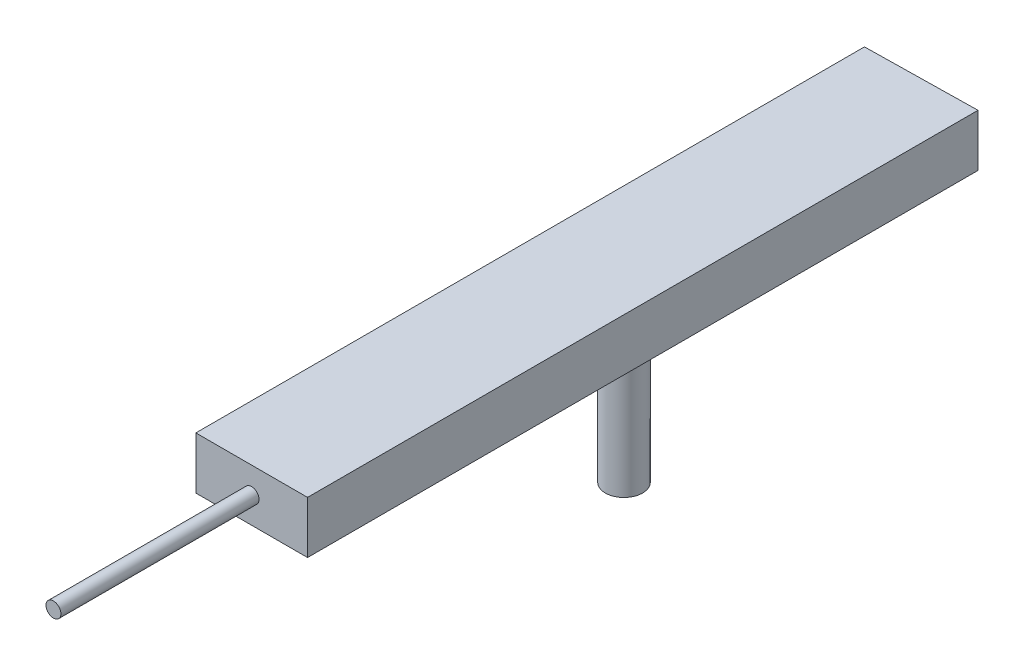
ISO-10303-21;
HEADER;
FILE_DESCRIPTION(('STEP AP214'),'2;1');
FILE_NAME('part.step','',(''),(''),'','','');
FILE_SCHEMA(('AUTOMOTIVE_DESIGN { 1 0 10303 214 1 1 1 1 }'));
ENDSEC;
DATA;
#1=APPLICATION_CONTEXT('core data for automotive mechanical design processes');
#2=APPLICATION_PROTOCOL_DEFINITION('international standard','automotive_design',2000,#1);
#3=PRODUCT_CONTEXT('',#1,'mechanical');
#4=PRODUCT('Part','Part','',(#3));
#5=PRODUCT_RELATED_PRODUCT_CATEGORY('part','',(#4));
#6=PRODUCT_DEFINITION_FORMATION('','',#4);
#7=PRODUCT_DEFINITION_CONTEXT('part definition',#1,'design');
#8=PRODUCT_DEFINITION('design','',#6,#7);
#9=PRODUCT_DEFINITION_SHAPE('','',#8);
#10=(LENGTH_UNIT() NAMED_UNIT(*) SI_UNIT(.MILLI.,.METRE.));
#11=(NAMED_UNIT(*) PLANE_ANGLE_UNIT() SI_UNIT($,.RADIAN.));
#12=(NAMED_UNIT(*) SI_UNIT($,.STERADIAN.) SOLID_ANGLE_UNIT());
#13=UNCERTAINTY_MEASURE_WITH_UNIT(LENGTH_MEASURE(1.E-05),#10,'distance_accuracy_value','');
#14=(GEOMETRIC_REPRESENTATION_CONTEXT(3) GLOBAL_UNCERTAINTY_ASSIGNED_CONTEXT((#13)) GLOBAL_UNIT_ASSIGNED_CONTEXT((#10,
#11,#12)) REPRESENTATION_CONTEXT('',''));
#15=CARTESIAN_POINT('',(0.,0.,0.));
#16=DIRECTION('',(0.,0.,1.));
#17=DIRECTION('',(1.,0.,0.));
#18=AXIS2_PLACEMENT_3D('',#15,#16,#17);
#19=CARTESIAN_POINT('',(3.74193592233407,1.75000005401671,60.0000002980232));
#20=DIRECTION('',(0.,0.,1.));
#21=DIRECTION('',(1.,0.,0.));
#22=AXIS2_PLACEMENT_3D('',#19,#20,#21);
#23=PLANE('',#22);
#24=CARTESIAN_POINT('',(3.74193592233407,1.75000005401671,60.0000002980232));
#25=DIRECTION('',(0.,0.,1.));
#26=DIRECTION('',(1.,0.,0.));
#27=AXIS2_PLACEMENT_3D('',#24,#25,#26);
#28=CIRCLE('',#27,0.5);
#29=CARTESIAN_POINT('',(4.24193592233407,1.75000005401671,60.0000002980232));
#30=VERTEX_POINT('',#29);
#31=EDGE_CURVE('E64',#30,#30,#28,.T.);
#32=ORIENTED_EDGE('',*,*,#31,.F.);
#33=EDGE_LOOP('',(#32));
#34=FACE_BOUND('',#33,.T.);
#35=ADVANCED_FACE('F57',(#34),#23,.F.);
#36=CARTESIAN_POINT('',(3.74193592233407,1.75000005401671,74.7181679039211));
#37=DIRECTION('',(0.,0.,-1.));
#38=DIRECTION('',(-1.,0.,0.));
#39=AXIS2_PLACEMENT_3D('',#36,#37,#38);
#40=CYLINDRICAL_SURFACE('',#39,0.5);
#41=CARTESIAN_POINT('',(3.74193592233407,1.75000005401671,73.303954341548));
#42=DIRECTION('',(0.,0.,-1.));
#43=DIRECTION('',(-1.,0.,0.));
#44=AXIS2_PLACEMENT_3D('',#41,#42,#43);
#45=CIRCLE('',#44,0.5);
#46=CARTESIAN_POINT('',(3.24193592233407,1.75000005401671,73.303954341548));
#47=VERTEX_POINT('',#46);
#48=EDGE_CURVE('E11',#47,#47,#45,.T.);
#49=ORIENTED_EDGE('',*,*,#48,.T.);
#50=EDGE_LOOP('',(#49));
#51=FACE_BOUND('',#50,.T.);
#52=ORIENTED_EDGE('',*,*,#31,.T.);
#53=EDGE_LOOP('',(#52));
#54=FACE_BOUND('',#53,.T.);
#55=ADVANCED_FACE('F59',(#51,#54),#40,.T.);
#56=CARTESIAN_POINT('',(-38.5882533593238,141.044708412088,73.3039543415482));
#57=DIRECTION('',(0.,0.,-1.));
#58=DIRECTION('',(1.,0.,0.));
#59=AXIS2_PLACEMENT_3D('',#56,#57,#58);
#60=PLANE('',#59);
#61=ORIENTED_EDGE('',*,*,#48,.F.);
#62=EDGE_LOOP('',(#61));
#63=FACE_BOUND('',#62,.T.);
#64=ADVANCED_FACE('F75',(#63),#60,.F.);
#65=CLOSED_SHELL('',(#35,#55,#64));
#66=MANIFOLD_SOLID_BREP('B2',#65);
#67=CARTESIAN_POINT('',(7.49999983236194,0.,78.2764728704216));
#68=DIRECTION('',(0.,-1.,0.));
#69=DIRECTION('',(0.,0.,-1.));
#70=AXIS2_PLACEMENT_3D('',#67,#68,#69);
#71=PLANE('',#70);
#72=CARTESIAN_POINT('',(3.75000016356773,0.,35.0000012364363));
#73=DIRECTION('',(0.,-1.,0.));
#74=DIRECTION('',(0.,0.,-1.));
#75=AXIS2_PLACEMENT_3D('',#72,#73,#74);
#76=CIRCLE('',#75,1.2499992750272);
#77=CARTESIAN_POINT('',(3.75000016356773,0.,33.7500019614091));
#78=VERTEX_POINT('',#77);
#79=EDGE_CURVE('E55',#78,#78,#76,.T.);
#80=ORIENTED_EDGE('',*,*,#79,.F.);
#81=EDGE_LOOP('',(#80));
#82=FACE_BOUND('',#81,.T.);
#83=DIRECTION('',(0.,0.,-1.));
#84=VECTOR('',#83,1.);
#85=CARTESIAN_POINT('',(7.49999983236194,0.,78.2764728704216));
#86=LINE('',#85,#84);
#87=CARTESIAN_POINT('',(7.49999983236194,0.,60.0000002980232));
#88=VERTEX_POINT('',#87);
#89=CARTESIAN_POINT('',(7.49999983236194,0.,14.9775894310468));
#90=VERTEX_POINT('',#89);
#91=EDGE_CURVE('E116',#88,#90,#86,.T.);
#92=ORIENTED_EDGE('',*,*,#91,.F.);
#93=DIRECTION('',(1.,0.,0.));
#94=VECTOR('',#93,1.);
#95=CARTESIAN_POINT('',(0.,0.,60.0000002980232));
#96=LINE('',#95,#94);
#97=CARTESIAN_POINT('',(0.,0.,60.0000002980232));
#98=VERTEX_POINT('',#97);
#99=EDGE_CURVE('E123',#98,#88,#96,.T.);
#100=ORIENTED_EDGE('',*,*,#99,.F.);
#101=DIRECTION('',(0.,0.,-1.));
#102=VECTOR('',#101,1.);
#103=CARTESIAN_POINT('',(0.,0.,78.2764728704216));
#104=LINE('',#103,#102);
#105=CARTESIAN_POINT('',(0.,0.,15.1018444358906));
#106=VERTEX_POINT('',#105);
#107=EDGE_CURVE('E159',#98,#106,#104,.T.);
#108=ORIENTED_EDGE('',*,*,#107,.T.);
#109=DIRECTION('',(-0.999862789961335,0.,0.0165650611449047));
#110=VECTOR('',#109,1.);
#111=CARTESIAN_POINT('',(7.36187995923574,0.,14.9798777091652));
#112=LINE('',#111,#110);
#113=EDGE_CURVE('E179',#90,#106,#112,.T.);
#114=ORIENTED_EDGE('',*,*,#113,.F.);
#115=EDGE_LOOP('',(#92,#100,#108,#114));
#116=FACE_BOUND('',#115,.T.);
#117=ADVANCED_FACE('F109',(#82,#116),#71,.T.);
#118=CARTESIAN_POINT('',(0.,3.50000010803342,78.2764728704216));
#119=DIRECTION('',(-1.,0.,0.));
#120=DIRECTION('',(0.,0.,1.));
#121=AXIS2_PLACEMENT_3D('',#118,#119,#120);
#122=PLANE('',#121);
#123=ORIENTED_EDGE('',*,*,#107,.F.);
#124=DIRECTION('',(0.,-1.,0.));
#125=VECTOR('',#124,1.);
#126=CARTESIAN_POINT('',(0.,3.50000010803342,60.0000002980232));
#127=LINE('',#126,#125);
#128=CARTESIAN_POINT('',(0.,3.50000010803342,60.0000002980232));
#129=VERTEX_POINT('',#128);
#130=EDGE_CURVE('E149',#129,#98,#127,.T.);
#131=ORIENTED_EDGE('',*,*,#130,.F.);
#132=DIRECTION('',(0.,0.,-1.));
#133=VECTOR('',#132,1.);
#134=CARTESIAN_POINT('',(0.,3.50000010803342,78.2764728704216));
#135=LINE('',#134,#133);
#136=CARTESIAN_POINT('',(0.,3.50000010803342,15.1018444358906));
#137=VERTEX_POINT('',#136);
#138=EDGE_CURVE('E167',#129,#137,#135,.T.);
#139=ORIENTED_EDGE('',*,*,#138,.T.);
#140=DIRECTION('',(0.,1.,0.));
#141=VECTOR('',#140,1.);
#142=CARTESIAN_POINT('',(0.,0.,15.1018444358906));
#143=LINE('',#142,#141);
#144=EDGE_CURVE('E166',#106,#137,#143,.T.);
#145=ORIENTED_EDGE('',*,*,#144,.F.);
#146=EDGE_LOOP('',(#123,#131,#139,#145));
#147=FACE_BOUND('',#146,.T.);
#148=ADVANCED_FACE('F164',(#147),#122,.T.);
#149=CARTESIAN_POINT('',(7.49999983236194,3.50000010803342,78.2764728704216));
#150=DIRECTION('',(0.,1.,0.));
#151=DIRECTION('',(0.,0.,1.));
#152=AXIS2_PLACEMENT_3D('',#149,#150,#151);
#153=PLANE('',#152);
#154=ORIENTED_EDGE('',*,*,#138,.F.);
#155=DIRECTION('',(-1.,0.,0.));
#156=VECTOR('',#155,1.);
#157=CARTESIAN_POINT('',(0.,3.50000010803342,60.0000002980232));
#158=LINE('',#157,#156);
#159=CARTESIAN_POINT('',(7.49999983236194,3.50000010803342,60.0000002980232));
#160=VERTEX_POINT('',#159);
#161=EDGE_CURVE('E151',#160,#129,#158,.T.);
#162=ORIENTED_EDGE('',*,*,#161,.F.);
#163=DIRECTION('',(0.,0.,-1.));
#164=VECTOR('',#163,1.);
#165=CARTESIAN_POINT('',(7.49999983236194,3.50000010803342,78.2764728704216));
#166=LINE('',#165,#164);
#167=CARTESIAN_POINT('',(7.49999983236194,3.50000010803342,14.9775894310468));
#168=VERTEX_POINT('',#167);
#169=EDGE_CURVE('E131',#160,#168,#166,.T.);
#170=ORIENTED_EDGE('',*,*,#169,.T.);
#171=DIRECTION('',(0.999862789961335,0.,-0.0165650611449047));
#172=VECTOR('',#171,1.);
#173=CARTESIAN_POINT('',(-0.136061863791688,3.50000010803342,15.1040986182803));
#174=LINE('',#173,#172);
#175=EDGE_CURVE('E172',#137,#168,#174,.T.);
#176=ORIENTED_EDGE('',*,*,#175,.F.);
#177=EDGE_LOOP('',(#154,#162,#170,#176));
#178=FACE_BOUND('',#177,.T.);
#179=ADVANCED_FACE('F186',(#178),#153,.T.);
#180=CARTESIAN_POINT('',(7.49999983236194,3.50000010803342,78.2764728704216));
#181=DIRECTION('',(1.,0.,0.));
#182=DIRECTION('',(0.,0.,-1.));
#183=AXIS2_PLACEMENT_3D('',#180,#181,#182);
#184=PLANE('',#183);
#185=ORIENTED_EDGE('',*,*,#169,.F.);
#186=DIRECTION('',(0.,1.,0.));
#187=VECTOR('',#186,1.);
#188=CARTESIAN_POINT('',(7.49999983236194,3.50000010803342,60.0000002980232));
#189=LINE('',#188,#187);
#190=EDGE_CURVE('E161',#88,#160,#189,.T.);
#191=ORIENTED_EDGE('',*,*,#190,.F.);
#192=ORIENTED_EDGE('',*,*,#91,.T.);
#193=DIRECTION('',(0.,-1.,0.));
#194=VECTOR('',#193,1.);
#195=CARTESIAN_POINT('',(7.49999983236194,3.50000010803342,14.9775894310468));
#196=LINE('',#195,#194);
#197=EDGE_CURVE('E181',#168,#90,#196,.T.);
#198=ORIENTED_EDGE('',*,*,#197,.F.);
#199=EDGE_LOOP('',(#185,#191,#192,#198));
#200=FACE_BOUND('',#199,.T.);
#201=ADVANCED_FACE('F187',(#200),#184,.T.);
#202=CARTESIAN_POINT('',(3.75000016356773,3.53553185540002,35.0000012364363));
#203=DIRECTION('',(0.,-1.,0.));
#204=DIRECTION('',(0.,0.,-1.));
#205=AXIS2_PLACEMENT_3D('',#202,#203,#204);
#206=CYLINDRICAL_SURFACE('',#205,1.2499992750272);
#207=CARTESIAN_POINT('',(3.75000016356773,-9.99999977648258,35.0000012364363));
#208=DIRECTION('',(0.,-1.,0.));
#209=DIRECTION('',(0.,0.,-1.));
#210=AXIS2_PLACEMENT_3D('',#207,#208,#209);
#211=CIRCLE('',#210,1.2499992750272);
#212=CARTESIAN_POINT('',(3.75000016356773,-9.99999977648258,33.7500019614091));
#213=VERTEX_POINT('',#212);
#214=EDGE_CURVE('E168',#213,#213,#211,.T.);
#215=CARTESIAN_POINT('',(3.75000016356773,0.,33.7500019614091));
#216=CARTESIAN_POINT('',(3.75000016356773,-0.10416666433836,33.7500019614091));
#217=CARTESIAN_POINT('',(3.75000016356773,-0.20833332867672,33.7500019614091));
#218=CARTESIAN_POINT('',(3.75000016356773,-0.41666665735344,33.7500019614091));
#219=CARTESIAN_POINT('',(3.75000016356773,-0.5208333216918,33.7500019614091));
#220=CARTESIAN_POINT('',(3.75000016356773,-0.729166650368521,33.7500019614091));
#221=CARTESIAN_POINT('',(3.75000016356773,-0.833333314706881,33.7500019614091));
#222=CARTESIAN_POINT('',(3.75000016356773,-1.0416666433836,33.7500019614091));
#223=CARTESIAN_POINT('',(3.75000016356773,-1.14583330772196,33.7500019614091));
#224=CARTESIAN_POINT('',(3.75000016356773,-1.35416663639868,33.7500019614091));
#225=CARTESIAN_POINT('',(3.75000016356773,-1.45833330073704,33.7500019614091));
#226=CARTESIAN_POINT('',(3.75000016356773,-1.66666662941376,33.7500019614091));
#227=CARTESIAN_POINT('',(3.75000016356773,-1.77083329375212,33.7500019614091));
#228=CARTESIAN_POINT('',(3.75000016356773,-1.97916662242884,33.7500019614091));
#229=CARTESIAN_POINT('',(3.75000016356773,-2.0833332867672,33.7500019614091));
#230=CARTESIAN_POINT('',(3.75000016356773,-2.29166661544392,33.7500019614091));
#231=CARTESIAN_POINT('',(3.75000016356773,-2.39583327978228,33.7500019614091));
#232=CARTESIAN_POINT('',(3.75000016356773,-2.604166608459,33.7500019614091));
#233=CARTESIAN_POINT('',(3.75000016356773,-2.70833327279736,33.7500019614091));
#234=CARTESIAN_POINT('',(3.75000016356773,-2.91666660147408,33.7500019614091));
#235=CARTESIAN_POINT('',(3.75000016356773,-3.02083326581245,33.7500019614091));
#236=CARTESIAN_POINT('',(3.75000016356773,-3.22916659448917,33.7500019614091));
#237=CARTESIAN_POINT('',(3.75000016356773,-3.33333325882752,33.7500019614091));
#238=CARTESIAN_POINT('',(3.75000016356773,-3.54166658750425,33.7500019614091));
#239=CARTESIAN_POINT('',(3.75000016356773,-3.64583325184261,33.7500019614091));
#240=CARTESIAN_POINT('',(3.75000016356773,-3.85416658051933,33.7500019614091));
#241=CARTESIAN_POINT('',(3.75000016356773,-3.95833324485769,33.7500019614091));
#242=CARTESIAN_POINT('',(3.75000016356773,-4.16666657353441,33.7500019614091));
#243=CARTESIAN_POINT('',(3.75000016356773,-4.27083323787277,33.7500019614091));
#244=CARTESIAN_POINT('',(3.75000016356773,-4.47916656654949,33.7500019614091));
#245=CARTESIAN_POINT('',(3.75000016356773,-4.58333323088785,33.7500019614091));
#246=CARTESIAN_POINT('',(3.75000016356773,-4.79166655956457,33.7500019614091));
#247=CARTESIAN_POINT('',(3.75000016356773,-4.89583322390293,33.7500019614091));
#248=CARTESIAN_POINT('',(3.75000016356773,-5.10416655257965,33.7500019614091));
#249=CARTESIAN_POINT('',(3.75000016356773,-5.20833321691801,33.7500019614091));
#250=CARTESIAN_POINT('',(3.75000016356773,-5.41666654559473,33.7500019614091));
#251=CARTESIAN_POINT('',(3.75000016356773,-5.52083320993309,33.7500019614091));
#252=CARTESIAN_POINT('',(3.75000016356773,-5.72916653860981,33.7500019614091));
#253=CARTESIAN_POINT('',(3.75000016356773,-5.83333320294817,33.7500019614091));
#254=CARTESIAN_POINT('',(3.75000016356773,-6.04166653162489,33.7500019614091));
#255=CARTESIAN_POINT('',(3.75000016356773,-6.14583319596325,33.7500019614091));
#256=CARTESIAN_POINT('',(3.75000016356773,-6.35416652463997,33.7500019614091));
#257=CARTESIAN_POINT('',(3.75000016356773,-6.45833318897833,33.7500019614091));
#258=CARTESIAN_POINT('',(3.75000016356773,-6.66666651765505,33.7500019614091));
#259=CARTESIAN_POINT('',(3.75000016356773,-6.77083318199341,33.7500019614091));
#260=CARTESIAN_POINT('',(3.75000016356773,-6.97916651067013,33.7500019614091));
#261=CARTESIAN_POINT('',(3.75000016356773,-7.08333317500849,33.7500019614091));
#262=CARTESIAN_POINT('',(3.75000016356773,-7.29166650368521,33.7500019614091));
#263=CARTESIAN_POINT('',(3.75000016356773,-7.39583316802357,33.7500019614091));
#264=CARTESIAN_POINT('',(3.75000016356773,-7.60416649670029,33.7500019614091));
#265=CARTESIAN_POINT('',(3.75000016356773,-7.70833316103865,33.7500019614091));
#266=CARTESIAN_POINT('',(3.75000016356773,-7.91666648971537,33.7500019614091));
#267=CARTESIAN_POINT('',(3.75000016356773,-8.02083315405373,33.7500019614091));
#268=CARTESIAN_POINT('',(3.75000016356773,-8.22916648273045,33.7500019614091));
#269=CARTESIAN_POINT('',(3.75000016356773,-8.33333314706881,33.7500019614091));
#270=CARTESIAN_POINT('',(3.75000016356773,-8.54166647574553,33.7500019614091));
#271=CARTESIAN_POINT('',(3.75000016356773,-8.64583314008389,33.7500019614091));
#272=CARTESIAN_POINT('',(3.75000016356773,-8.85416646876061,33.7500019614091));
#273=CARTESIAN_POINT('',(3.75000016356773,-8.95833313309898,33.7500019614091));
#274=CARTESIAN_POINT('',(3.75000016356773,-9.16666646177569,33.7500019614091));
#275=CARTESIAN_POINT('',(3.75000016356773,-9.27083312611406,33.7500019614091));
#276=CARTESIAN_POINT('',(3.75000016356773,-9.47916645479078,33.7500019614091));
#277=CARTESIAN_POINT('',(3.75000016356773,-9.58333311912914,33.7500019614091));
#278=CARTESIAN_POINT('',(3.75000016356773,-9.79166644780586,33.7500019614091));
#279=CARTESIAN_POINT('',(3.75000016356773,-9.89583311214422,33.7500019614091));
#280=CARTESIAN_POINT('',(3.75000016356773,-9.99999977648258,33.7500019614091));
#281=B_SPLINE_CURVE_WITH_KNOTS('',3,(#215,#216,#217,#218,#219,#220,#221,#222,#223,#224,#225,
#226,#227,#228,#229,#230,#231,#232,#233,#234,#235,#236,#237,#238,#239,#240,#241,#242,#243,#244,
#245,#246,#247,#248,#249,#250,#251,#252,#253,#254,#255,#256,#257,#258,#259,#260,#261,#262,#263,
#264,#265,#266,#267,#268,#269,#270,#271,#272,#273,#274,#275,#276,#277,#278,#279,#280),
.UNSPECIFIED.,.F.,.F.,(4,2,2,2,2,2,2,2,2,2,2,2,2,2,2,2,2,2,2,2,2,2,2,2,2,2,2,2,2,2,2,2,4),(0.,
0.312499993015081,0.624999986030161,0.937499979045242,1.24999997206032,1.5624999650754,
1.87499995809048,2.18749995110556,2.49999994412064,2.81249993713572,3.12499993015081,
3.43749992316589,3.74999991618097,4.06249990919605,4.37499990221113,4.68749989522621,
4.99999988824129,5.31249988125637,5.62499987427145,5.93749986728653,6.24999986030161,
6.56249985331669,6.87499984633177,7.18749983934685,7.49999983236193,7.81249982537701,
8.12499981839209,8.43749981140718,8.74999980442226,9.06249979743734,9.37499979045242,
9.6874997834675,9.99999977648258),.UNSPECIFIED.);
#282=EDGE_CURVE('BSEAM199',#78,#213,#281,.T.);
#283=ORIENTED_EDGE('',*,*,#79,.T.);
#284=ORIENTED_EDGE('',*,*,#214,.F.);
#285=ORIENTED_EDGE('',*,*,#282,.T.);
#286=ORIENTED_EDGE('',*,*,#282,.F.);
#287=EDGE_LOOP('',(#283,#285,#284,#286));
#288=FACE_BOUND('',#287,.T.);
#289=ADVANCED_FACE('F199',(#288),#206,.T.);
#290=CARTESIAN_POINT('',(3.75000016356773,-9.99999977648258,35.0000012364363));
#291=DIRECTION('',(0.,-1.,0.));
#292=DIRECTION('',(0.,0.,-1.));
#293=AXIS2_PLACEMENT_3D('',#290,#291,#292);
#294=PLANE('',#293);
#295=ORIENTED_EDGE('',*,*,#214,.T.);
#296=EDGE_LOOP('',(#295));
#297=FACE_BOUND('',#296,.T.);
#298=ADVANCED_FACE('F191',(#297),#294,.T.);
#299=CARTESIAN_POINT('',(6.7509066981884,11.8999999962747,14.9899999074595));
#300=DIRECTION('',(0.0165650611449047,0.,0.999862789961336));
#301=DIRECTION('',(0.999862789961336,0.,-0.0165650611449047));
#302=AXIS2_PLACEMENT_3D('',#299,#300,#301);
#303=PLANE('',#302);
#304=ORIENTED_EDGE('',*,*,#175,.T.);
#305=ORIENTED_EDGE('',*,*,#197,.T.);
#306=ORIENTED_EDGE('',*,*,#113,.T.);
#307=ORIENTED_EDGE('',*,*,#144,.T.);
#308=EDGE_LOOP('',(#304,#305,#306,#307));
#309=FACE_BOUND('',#308,.T.);
#310=ADVANCED_FACE('F189',(#309),#303,.F.);
#311=CARTESIAN_POINT('',(0.,0.,60.0000002980232));
#312=DIRECTION('',(0.,0.,1.));
#313=DIRECTION('',(1.,0.,0.));
#314=AXIS2_PLACEMENT_3D('',#311,#312,#313);
#315=PLANE('',#314);
#316=ORIENTED_EDGE('',*,*,#130,.T.);
#317=ORIENTED_EDGE('',*,*,#99,.T.);
#318=ORIENTED_EDGE('',*,*,#190,.T.);
#319=ORIENTED_EDGE('',*,*,#161,.T.);
#320=EDGE_LOOP('',(#316,#317,#318,#319));
#321=FACE_BOUND('',#320,.T.);
#322=ADVANCED_FACE('F150',(#321),#315,.T.);
#323=CLOSED_SHELL('',(#117,#148,#179,#201,#289,#298,#310,#322));
#324=MANIFOLD_SOLID_BREP('B6',#323);
#325=ADVANCED_BREP_SHAPE_REPRESENTATION('',(#18,#66,#324),#14);
#326=SHAPE_DEFINITION_REPRESENTATION(#9,#325);
ENDSEC;
END-ISO-10303-21;
